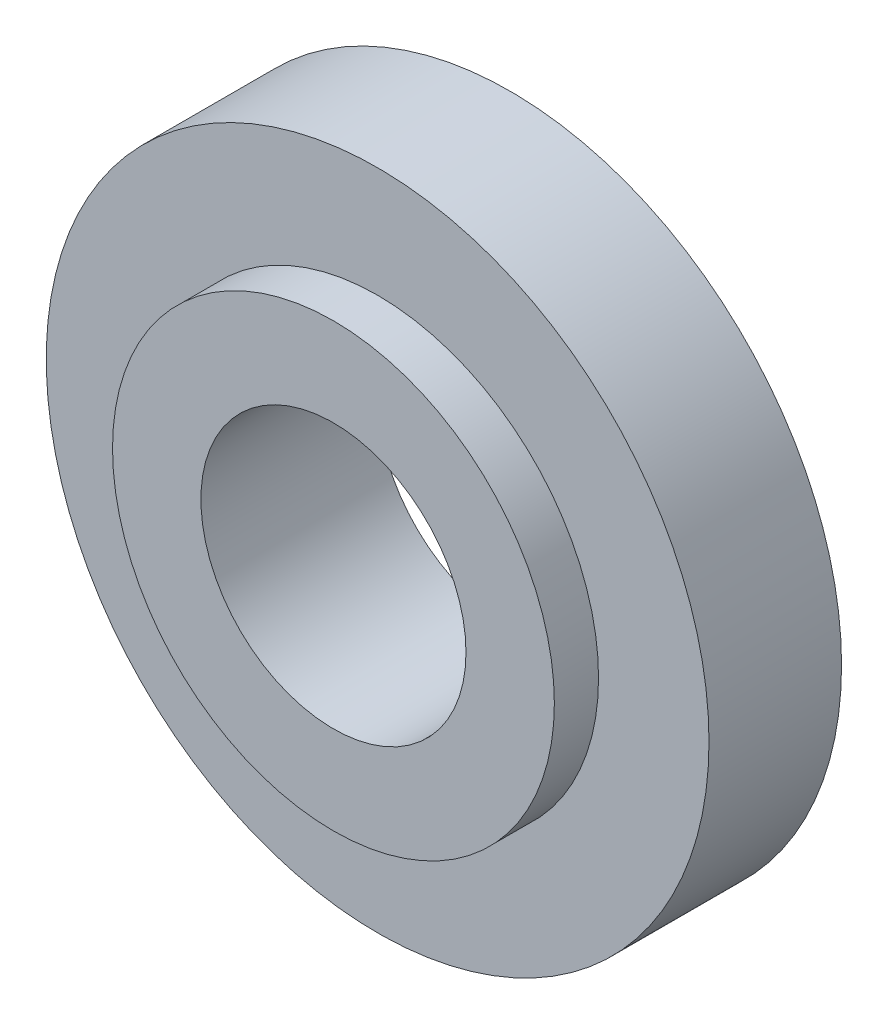
ISO-10303-21;
HEADER;
FILE_DESCRIPTION(('STEP AP214'),'2;1');
FILE_NAME('part.step','',(''),(''),'','','');
FILE_SCHEMA(('AUTOMOTIVE_DESIGN { 1 0 10303 214 1 1 1 1 }'));
ENDSEC;
DATA;
#1=APPLICATION_CONTEXT('core data for automotive mechanical design processes');
#2=APPLICATION_PROTOCOL_DEFINITION('international standard','automotive_design',2000,#1);
#3=PRODUCT_CONTEXT('',#1,'mechanical');
#4=PRODUCT('Part','Part','',(#3));
#5=PRODUCT_RELATED_PRODUCT_CATEGORY('part','',(#4));
#6=PRODUCT_DEFINITION_FORMATION('','',#4);
#7=PRODUCT_DEFINITION_CONTEXT('part definition',#1,'design');
#8=PRODUCT_DEFINITION('design','',#6,#7);
#9=PRODUCT_DEFINITION_SHAPE('','',#8);
#10=(LENGTH_UNIT() NAMED_UNIT(*) SI_UNIT(.MILLI.,.METRE.));
#11=(NAMED_UNIT(*) PLANE_ANGLE_UNIT() SI_UNIT($,.RADIAN.));
#12=(NAMED_UNIT(*) SI_UNIT($,.STERADIAN.) SOLID_ANGLE_UNIT());
#13=UNCERTAINTY_MEASURE_WITH_UNIT(LENGTH_MEASURE(1.E-05),#10,'distance_accuracy_value','');
#14=(GEOMETRIC_REPRESENTATION_CONTEXT(3) GLOBAL_UNCERTAINTY_ASSIGNED_CONTEXT((#13)) GLOBAL_UNIT_ASSIGNED_CONTEXT((#10,
#11,#12)) REPRESENTATION_CONTEXT('',''));
#15=CARTESIAN_POINT('',(0.,0.,0.));
#16=DIRECTION('',(0.,0.,1.));
#17=DIRECTION('',(1.,0.,0.));
#18=AXIS2_PLACEMENT_3D('',#15,#16,#17);
#19=CARTESIAN_POINT('',(0.,0.,-1.5));
#20=DIRECTION('',(0.,0.,1.));
#21=DIRECTION('',(1.,0.,0.));
#22=AXIS2_PLACEMENT_3D('',#19,#20,#21);
#23=CYLINDRICAL_SURFACE('',#22,3.75);
#24=CARTESIAN_POINT('',(0.,0.,-1.5));
#25=DIRECTION('',(0.,0.,1.));
#26=DIRECTION('',(1.,0.,0.));
#27=AXIS2_PLACEMENT_3D('',#24,#25,#26);
#28=CIRCLE('',#27,3.75);
#29=CARTESIAN_POINT('',(3.75,0.,-1.5));
#30=VERTEX_POINT('',#29);
#31=EDGE_CURVE('E41',#30,#30,#28,.T.);
#32=ORIENTED_EDGE('',*,*,#31,.T.);
#33=EDGE_LOOP('',(#32));
#34=FACE_BOUND('',#33,.T.);
#35=CARTESIAN_POINT('',(0.,0.,0.));
#36=DIRECTION('',(0.,0.,1.));
#37=DIRECTION('',(1.,0.,0.));
#38=AXIS2_PLACEMENT_3D('',#35,#36,#37);
#39=CIRCLE('',#38,3.75);
#40=CARTESIAN_POINT('',(3.75,0.,0.));
#41=VERTEX_POINT('',#40);
#42=EDGE_CURVE('E37',#41,#41,#39,.T.);
#43=ORIENTED_EDGE('',*,*,#42,.F.);
#44=EDGE_LOOP('',(#43));
#45=FACE_BOUND('',#44,.T.);
#46=ADVANCED_FACE('F34',(#34,#45),#23,.T.);
#47=CARTESIAN_POINT('',(0.,0.,-1.5));
#48=DIRECTION('',(0.,0.,1.));
#49=DIRECTION('',(1.,0.,0.));
#50=AXIS2_PLACEMENT_3D('',#47,#48,#49);
#51=CYLINDRICAL_SURFACE('',#50,1.5);
#52=CARTESIAN_POINT('',(0.,0.,-1.5));
#53=DIRECTION('',(0.,0.,1.));
#54=DIRECTION('',(1.,0.,0.));
#55=AXIS2_PLACEMENT_3D('',#52,#53,#54);
#56=CIRCLE('',#55,1.5);
#57=CARTESIAN_POINT('',(1.5,0.,-1.5));
#58=VERTEX_POINT('',#57);
#59=EDGE_CURVE('E10',#58,#58,#56,.T.);
#60=ORIENTED_EDGE('',*,*,#59,.F.);
#61=EDGE_LOOP('',(#60));
#62=FACE_BOUND('',#61,.T.);
#63=CARTESIAN_POINT('',(0.,0.,0.5));
#64=DIRECTION('',(0.,0.,1.));
#65=DIRECTION('',(1.,0.,0.));
#66=AXIS2_PLACEMENT_3D('',#63,#64,#65);
#67=CIRCLE('',#66,1.5);
#68=CARTESIAN_POINT('',(1.5,0.,0.5));
#69=VERTEX_POINT('',#68);
#70=EDGE_CURVE('E50',#69,#69,#67,.T.);
#71=ORIENTED_EDGE('',*,*,#70,.T.);
#72=EDGE_LOOP('',(#71));
#73=FACE_BOUND('',#72,.T.);
#74=ADVANCED_FACE('F57',(#62,#73),#51,.F.);
#75=CARTESIAN_POINT('',(0.,0.,-1.5));
#76=DIRECTION('',(0.,0.,1.));
#77=DIRECTION('',(1.,0.,0.));
#78=AXIS2_PLACEMENT_3D('',#75,#76,#77);
#79=PLANE('',#78);
#80=ORIENTED_EDGE('',*,*,#31,.F.);
#81=EDGE_LOOP('',(#80));
#82=FACE_BOUND('',#81,.T.);
#83=ORIENTED_EDGE('',*,*,#59,.T.);
#84=EDGE_LOOP('',(#83));
#85=FACE_BOUND('',#84,.T.);
#86=ADVANCED_FACE('F74',(#82,#85),#79,.F.);
#87=CARTESIAN_POINT('',(0.,0.,0.));
#88=DIRECTION('',(0.,0.,1.));
#89=DIRECTION('',(1.,0.,0.));
#90=AXIS2_PLACEMENT_3D('',#87,#88,#89);
#91=PLANE('',#90);
#92=CARTESIAN_POINT('',(0.,0.,0.));
#93=DIRECTION('',(0.,0.,1.));
#94=DIRECTION('',(1.,0.,0.));
#95=AXIS2_PLACEMENT_3D('',#92,#93,#94);
#96=CIRCLE('',#95,2.5);
#97=CARTESIAN_POINT('',(2.5,0.,0.));
#98=VERTEX_POINT('',#97);
#99=EDGE_CURVE('E47',#98,#98,#96,.T.);
#100=ORIENTED_EDGE('',*,*,#99,.F.);
#101=EDGE_LOOP('',(#100));
#102=FACE_BOUND('',#101,.T.);
#103=ORIENTED_EDGE('',*,*,#42,.T.);
#104=EDGE_LOOP('',(#103));
#105=FACE_BOUND('',#104,.T.);
#106=ADVANCED_FACE('F68',(#102,#105),#91,.T.);
#107=CARTESIAN_POINT('',(0.,0.,0.5));
#108=DIRECTION('',(0.,0.,-1.));
#109=DIRECTION('',(-1.,0.,0.));
#110=AXIS2_PLACEMENT_3D('',#107,#108,#109);
#111=CYLINDRICAL_SURFACE('',#110,2.5);
#112=CARTESIAN_POINT('',(0.,0.,0.5));
#113=DIRECTION('',(0.,0.,1.));
#114=DIRECTION('',(1.,0.,0.));
#115=AXIS2_PLACEMENT_3D('',#112,#113,#114);
#116=CIRCLE('',#115,2.5);
#117=CARTESIAN_POINT('',(2.5,0.,0.5));
#118=VERTEX_POINT('',#117);
#119=EDGE_CURVE('E51',#118,#118,#116,.T.);
#120=ORIENTED_EDGE('',*,*,#119,.F.);
#121=EDGE_LOOP('',(#120));
#122=FACE_BOUND('',#121,.T.);
#123=ORIENTED_EDGE('',*,*,#99,.T.);
#124=EDGE_LOOP('',(#123));
#125=FACE_BOUND('',#124,.T.);
#126=ADVANCED_FACE('F62',(#122,#125),#111,.T.);
#127=CARTESIAN_POINT('',(0.,0.,0.5));
#128=DIRECTION('',(0.,0.,1.));
#129=DIRECTION('',(1.,0.,0.));
#130=AXIS2_PLACEMENT_3D('',#127,#128,#129);
#131=PLANE('',#130);
#132=ORIENTED_EDGE('',*,*,#70,.F.);
#133=EDGE_LOOP('',(#132));
#134=FACE_BOUND('',#133,.T.);
#135=ORIENTED_EDGE('',*,*,#119,.T.);
#136=EDGE_LOOP('',(#135));
#137=FACE_BOUND('',#136,.T.);
#138=ADVANCED_FACE('F59',(#134,#137),#131,.T.);
#139=CLOSED_SHELL('',(#46,#74,#86,#106,#126,#138));
#140=MANIFOLD_SOLID_BREP('B2',#139);
#141=ADVANCED_BREP_SHAPE_REPRESENTATION('',(#18,#140),#14);
#142=SHAPE_DEFINITION_REPRESENTATION(#9,#141);
ENDSEC;
END-ISO-10303-21;
